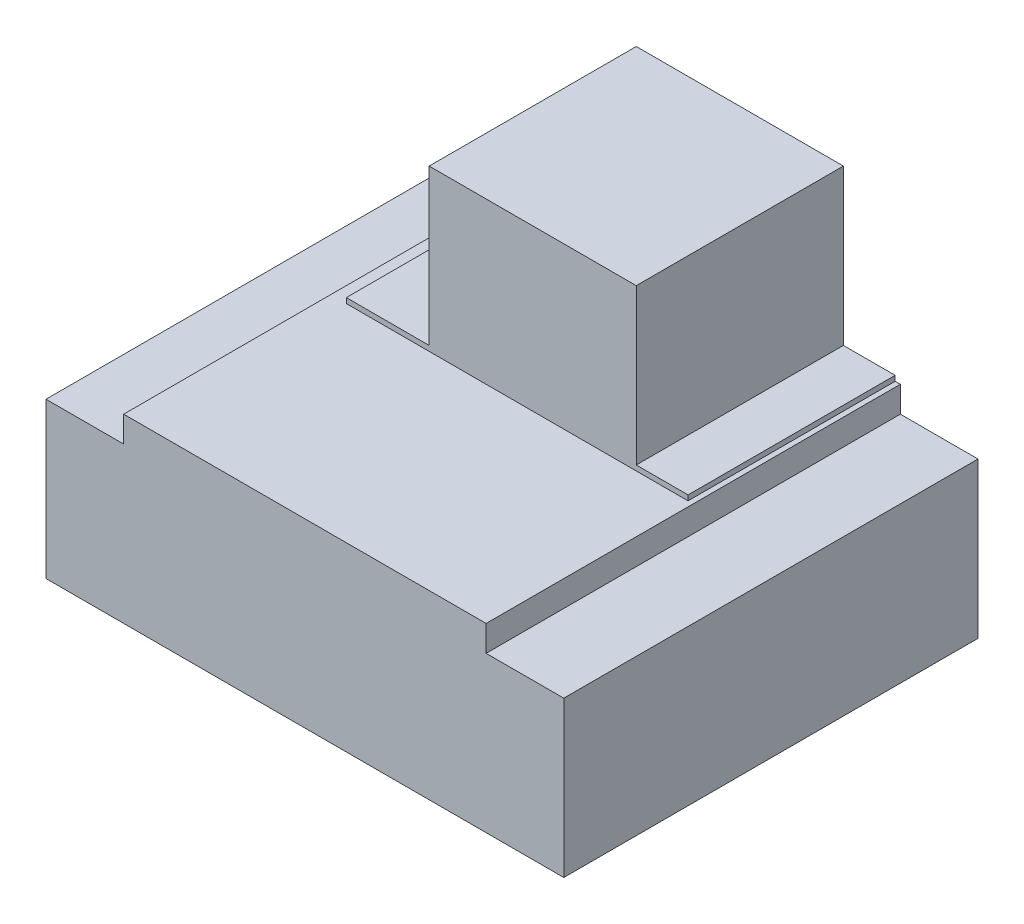
ISO-10303-21;
HEADER;
FILE_DESCRIPTION(('STEP AP214'),'2;1');
FILE_NAME('part.step','',(''),(''),'','','');
FILE_SCHEMA(('AUTOMOTIVE_DESIGN { 1 0 10303 214 1 1 1 1 }'));
ENDSEC;
DATA;
#1=APPLICATION_CONTEXT('core data for automotive mechanical design processes');
#2=APPLICATION_PROTOCOL_DEFINITION('international standard','automotive_design',2000,#1);
#3=PRODUCT_CONTEXT('',#1,'mechanical');
#4=PRODUCT('Part','Part','',(#3));
#5=PRODUCT_RELATED_PRODUCT_CATEGORY('part','',(#4));
#6=PRODUCT_DEFINITION_FORMATION('','',#4);
#7=PRODUCT_DEFINITION_CONTEXT('part definition',#1,'design');
#8=PRODUCT_DEFINITION('design','',#6,#7);
#9=PRODUCT_DEFINITION_SHAPE('','',#8);
#10=(LENGTH_UNIT() NAMED_UNIT(*) SI_UNIT(.MILLI.,.METRE.));
#11=(NAMED_UNIT(*) PLANE_ANGLE_UNIT() SI_UNIT($,.RADIAN.));
#12=(NAMED_UNIT(*) SI_UNIT($,.STERADIAN.) SOLID_ANGLE_UNIT());
#13=UNCERTAINTY_MEASURE_WITH_UNIT(LENGTH_MEASURE(1.E-05),#10,'distance_accuracy_value','');
#14=(GEOMETRIC_REPRESENTATION_CONTEXT(3) GLOBAL_UNCERTAINTY_ASSIGNED_CONTEXT((#13)) GLOBAL_UNIT_ASSIGNED_CONTEXT((#10,
#11,#12)) REPRESENTATION_CONTEXT('',''));
#15=CARTESIAN_POINT('',(0.,0.,0.));
#16=DIRECTION('',(0.,0.,1.));
#17=DIRECTION('',(1.,0.,0.));
#18=AXIS2_PLACEMENT_3D('',#15,#16,#17);
#19=CARTESIAN_POINT('',(0.,35.,0.));
#20=DIRECTION('',(1.,0.,0.));
#21=DIRECTION('',(0.,0.,-1.));
#22=AXIS2_PLACEMENT_3D('',#19,#20,#21);
#23=PLANE('',#22);
#24=DIRECTION('',(0.,0.,1.));
#25=VECTOR('',#24,1.);
#26=CARTESIAN_POINT('',(0.,30.,-80.));
#27=LINE('',#26,#25);
#28=CARTESIAN_POINT('',(0.,30.,-80.));
#29=VERTEX_POINT('',#28);
#30=CARTESIAN_POINT('',(0.,30.,0.));
#31=VERTEX_POINT('',#30);
#32=EDGE_CURVE('E145',#29,#31,#27,.T.);
#33=ORIENTED_EDGE('',*,*,#32,.F.);
#34=DIRECTION('',(0.,-1.,0.));
#35=VECTOR('',#34,1.);
#36=CARTESIAN_POINT('',(0.,35.,-80.));
#37=LINE('',#36,#35);
#38=CARTESIAN_POINT('',(0.,0.,-80.));
#39=VERTEX_POINT('',#38);
#40=EDGE_CURVE('E167',#29,#39,#37,.T.);
#41=ORIENTED_EDGE('',*,*,#40,.T.);
#42=DIRECTION('',(0.,0.,1.));
#43=VECTOR('',#42,1.);
#44=CARTESIAN_POINT('',(0.,0.,0.));
#45=LINE('',#44,#43);
#46=CARTESIAN_POINT('',(0.,0.,0.));
#47=VERTEX_POINT('',#46);
#48=EDGE_CURVE('E166',#39,#47,#45,.T.);
#49=ORIENTED_EDGE('',*,*,#48,.T.);
#50=DIRECTION('',(0.,-1.,0.));
#51=VECTOR('',#50,1.);
#52=CARTESIAN_POINT('',(0.,35.,0.));
#53=LINE('',#52,#51);
#54=EDGE_CURVE('E11',#31,#47,#53,.T.);
#55=ORIENTED_EDGE('',*,*,#54,.F.);
#56=EDGE_LOOP('',(#33,#41,#49,#55));
#57=FACE_BOUND('',#56,.T.);
#58=ADVANCED_FACE('F35',(#57),#23,.F.);
#59=CARTESIAN_POINT('',(0.,36.,0.));
#60=DIRECTION('',(0.,1.,0.));
#61=DIRECTION('',(0.,0.,1.));
#62=AXIS2_PLACEMENT_3D('',#59,#60,#61);
#63=PLANE('',#62);
#64=DIRECTION('',(0.,0.,1.));
#65=VECTOR('',#64,1.);
#66=CARTESIAN_POINT('',(34.,36.,-80.));
#67=LINE('',#66,#65);
#68=CARTESIAN_POINT('',(34.,36.,-80.));
#69=VERTEX_POINT('',#68);
#70=CARTESIAN_POINT('',(34.,36.,-40.));
#71=VERTEX_POINT('',#70);
#72=EDGE_CURVE('E229',#69,#71,#67,.T.);
#73=ORIENTED_EDGE('',*,*,#72,.F.);
#74=DIRECTION('',(-1.,0.,0.));
#75=VECTOR('',#74,1.);
#76=CARTESIAN_POINT('',(18.,36.,-80.));
#77=LINE('',#76,#75);
#78=CARTESIAN_POINT('',(18.,36.,-80.));
#79=VERTEX_POINT('',#78);
#80=EDGE_CURVE('E256',#69,#79,#77,.T.);
#81=ORIENTED_EDGE('',*,*,#80,.T.);
#82=DIRECTION('',(0.,0.,1.));
#83=VECTOR('',#82,1.);
#84=CARTESIAN_POINT('',(18.,36.,-80.));
#85=LINE('',#84,#83);
#86=CARTESIAN_POINT('',(18.,36.,-40.));
#87=VERTEX_POINT('',#86);
#88=EDGE_CURVE('E247',#79,#87,#85,.T.);
#89=ORIENTED_EDGE('',*,*,#88,.T.);
#90=DIRECTION('',(1.,0.,0.));
#91=VECTOR('',#90,1.);
#92=CARTESIAN_POINT('',(18.,36.,-40.));
#93=LINE('',#92,#91);
#94=EDGE_CURVE('E252',#87,#71,#93,.T.);
#95=ORIENTED_EDGE('',*,*,#94,.T.);
#96=EDGE_LOOP('',(#73,#81,#89,#95));
#97=FACE_BOUND('',#96,.T.);
#98=ADVANCED_FACE('F306',(#97),#63,.T.);
#99=CARTESIAN_POINT('',(0.,35.,0.));
#100=DIRECTION('',(0.,-1.,0.));
#101=DIRECTION('',(0.,0.,-1.));
#102=AXIS2_PLACEMENT_3D('',#99,#100,#101);
#103=PLANE('',#102);
#104=DIRECTION('',(-1.,0.,0.));
#105=VECTOR('',#104,1.);
#106=CARTESIAN_POINT('',(0.,35.,-80.));
#107=LINE('',#106,#105);
#108=CARTESIAN_POINT('',(18.,35.,-80.));
#109=VERTEX_POINT('',#108);
#110=CARTESIAN_POINT('',(15.,35.,-80.));
#111=VERTEX_POINT('',#110);
#112=EDGE_CURVE('E274',#109,#111,#107,.T.);
#113=ORIENTED_EDGE('',*,*,#112,.T.);
#114=DIRECTION('',(0.,0.,-1.));
#115=VECTOR('',#114,1.);
#116=CARTESIAN_POINT('',(15.,35.,-80.));
#117=LINE('',#116,#115);
#118=CARTESIAN_POINT('',(15.,35.,0.));
#119=VERTEX_POINT('',#118);
#120=EDGE_CURVE('E155',#119,#111,#117,.T.);
#121=ORIENTED_EDGE('',*,*,#120,.F.);
#122=DIRECTION('',(1.,0.,0.));
#123=VECTOR('',#122,1.);
#124=CARTESIAN_POINT('',(0.,35.,0.));
#125=LINE('',#124,#123);
#126=CARTESIAN_POINT('',(85.,35.,0.));
#127=VERTEX_POINT('',#126);
#128=EDGE_CURVE('E187',#119,#127,#125,.T.);
#129=ORIENTED_EDGE('',*,*,#128,.T.);
#130=DIRECTION('',(0.,0.,1.));
#131=VECTOR('',#130,1.);
#132=CARTESIAN_POINT('',(85.,35.,-80.));
#133=LINE('',#132,#131);
#134=CARTESIAN_POINT('',(85.,35.,-80.));
#135=VERTEX_POINT('',#134);
#136=EDGE_CURVE('E208',#135,#127,#133,.T.);
#137=ORIENTED_EDGE('',*,*,#136,.F.);
#138=CARTESIAN_POINT('',(84.,35.,-80.));
#139=VERTEX_POINT('',#138);
#140=EDGE_CURVE('E180',#135,#139,#107,.T.);
#141=ORIENTED_EDGE('',*,*,#140,.T.);
#142=DIRECTION('',(0.,0.,-1.));
#143=VECTOR('',#142,1.);
#144=CARTESIAN_POINT('',(84.,35.,-80.));
#145=LINE('',#144,#143);
#146=CARTESIAN_POINT('',(84.,35.,-40.));
#147=VERTEX_POINT('',#146);
#148=EDGE_CURVE('E251',#147,#139,#145,.T.);
#149=ORIENTED_EDGE('',*,*,#148,.F.);
#150=DIRECTION('',(1.,0.,0.));
#151=VECTOR('',#150,1.);
#152=CARTESIAN_POINT('',(18.,35.,-40.));
#153=LINE('',#152,#151);
#154=CARTESIAN_POINT('',(18.,35.,-40.));
#155=VERTEX_POINT('',#154);
#156=EDGE_CURVE('E262',#155,#147,#153,.T.);
#157=ORIENTED_EDGE('',*,*,#156,.F.);
#158=DIRECTION('',(0.,0.,1.));
#159=VECTOR('',#158,1.);
#160=CARTESIAN_POINT('',(18.,35.,-80.));
#161=LINE('',#160,#159);
#162=EDGE_CURVE('E246',#109,#155,#161,.T.);
#163=ORIENTED_EDGE('',*,*,#162,.F.);
#164=EDGE_LOOP('',(#113,#121,#129,#137,#141,#149,#157,#163));
#165=FACE_BOUND('',#164,.T.);
#166=ADVANCED_FACE('F280',(#165),#103,.F.);
#167=CARTESIAN_POINT('',(0.,35.,0.));
#168=DIRECTION('',(0.,0.,-1.));
#169=DIRECTION('',(-1.,0.,0.));
#170=AXIS2_PLACEMENT_3D('',#167,#168,#169);
#171=PLANE('',#170);
#172=ORIENTED_EDGE('',*,*,#128,.F.);
#173=DIRECTION('',(0.,1.,0.));
#174=VECTOR('',#173,1.);
#175=CARTESIAN_POINT('',(15.,30.,0.));
#176=LINE('',#175,#174);
#177=CARTESIAN_POINT('',(15.,30.,0.));
#178=VERTEX_POINT('',#177);
#179=EDGE_CURVE('E162',#178,#119,#176,.T.);
#180=ORIENTED_EDGE('',*,*,#179,.F.);
#181=DIRECTION('',(1.,0.,0.));
#182=VECTOR('',#181,1.);
#183=CARTESIAN_POINT('',(0.,30.,0.));
#184=LINE('',#183,#182);
#185=EDGE_CURVE('E148',#31,#178,#184,.T.);
#186=ORIENTED_EDGE('',*,*,#185,.F.);
#187=ORIENTED_EDGE('',*,*,#54,.T.);
#188=DIRECTION('',(1.,0.,0.));
#189=VECTOR('',#188,1.);
#190=CARTESIAN_POINT('',(0.,0.,0.));
#191=LINE('',#190,#189);
#192=CARTESIAN_POINT('',(100.,0.,0.));
#193=VERTEX_POINT('',#192);
#194=EDGE_CURVE('E171',#47,#193,#191,.T.);
#195=ORIENTED_EDGE('',*,*,#194,.T.);
#196=DIRECTION('',(0.,-1.,0.));
#197=VECTOR('',#196,1.);
#198=CARTESIAN_POINT('',(100.,35.,0.));
#199=LINE('',#198,#197);
#200=CARTESIAN_POINT('',(100.,30.,0.));
#201=VERTEX_POINT('',#200);
#202=EDGE_CURVE('E42',#201,#193,#199,.T.);
#203=ORIENTED_EDGE('',*,*,#202,.F.);
#204=DIRECTION('',(1.,0.,0.));
#205=VECTOR('',#204,1.);
#206=CARTESIAN_POINT('',(100.,30.,0.));
#207=LINE('',#206,#205);
#208=CARTESIAN_POINT('',(85.,30.,0.));
#209=VERTEX_POINT('',#208);
#210=EDGE_CURVE('E206',#209,#201,#207,.T.);
#211=ORIENTED_EDGE('',*,*,#210,.F.);
#212=DIRECTION('',(0.,1.,0.));
#213=VECTOR('',#212,1.);
#214=CARTESIAN_POINT('',(85.,30.,0.));
#215=LINE('',#214,#213);
#216=EDGE_CURVE('E214',#209,#127,#215,.T.);
#217=ORIENTED_EDGE('',*,*,#216,.T.);
#218=EDGE_LOOP('',(#172,#180,#186,#187,#195,#203,#211,#217));
#219=FACE_BOUND('',#218,.T.);
#220=ADVANCED_FACE('F159',(#219),#171,.F.);
#221=CARTESIAN_POINT('',(100.,35.,0.));
#222=DIRECTION('',(-1.,0.,0.));
#223=DIRECTION('',(0.,0.,1.));
#224=AXIS2_PLACEMENT_3D('',#221,#222,#223);
#225=PLANE('',#224);
#226=DIRECTION('',(0.,-1.,0.));
#227=VECTOR('',#226,1.);
#228=CARTESIAN_POINT('',(100.,35.,-80.));
#229=LINE('',#228,#227);
#230=CARTESIAN_POINT('',(100.,30.,-80.));
#231=VERTEX_POINT('',#230);
#232=CARTESIAN_POINT('',(100.,0.,-80.));
#233=VERTEX_POINT('',#232);
#234=EDGE_CURVE('E189',#231,#233,#229,.T.);
#235=ORIENTED_EDGE('',*,*,#234,.F.);
#236=DIRECTION('',(0.,0.,-1.));
#237=VECTOR('',#236,1.);
#238=CARTESIAN_POINT('',(100.,30.,-80.));
#239=LINE('',#238,#237);
#240=EDGE_CURVE('E57',#201,#231,#239,.T.);
#241=ORIENTED_EDGE('',*,*,#240,.F.);
#242=ORIENTED_EDGE('',*,*,#202,.T.);
#243=DIRECTION('',(0.,0.,-1.));
#244=VECTOR('',#243,1.);
#245=CARTESIAN_POINT('',(100.,0.,0.));
#246=LINE('',#245,#244);
#247=EDGE_CURVE('E174',#193,#233,#246,.T.);
#248=ORIENTED_EDGE('',*,*,#247,.T.);
#249=EDGE_LOOP('',(#235,#241,#242,#248));
#250=FACE_BOUND('',#249,.T.);
#251=ADVANCED_FACE('F193',(#250),#225,.F.);
#252=CARTESIAN_POINT('',(0.,35.,-80.));
#253=DIRECTION('',(0.,0.,1.));
#254=DIRECTION('',(1.,0.,0.));
#255=AXIS2_PLACEMENT_3D('',#252,#253,#254);
#256=PLANE('',#255);
#257=DIRECTION('',(-1.,0.,0.));
#258=VECTOR('',#257,1.);
#259=CARTESIAN_POINT('',(0.,30.,-80.));
#260=LINE('',#259,#258);
#261=CARTESIAN_POINT('',(15.,30.,-80.));
#262=VERTEX_POINT('',#261);
#263=EDGE_CURVE('E151',#262,#29,#260,.T.);
#264=ORIENTED_EDGE('',*,*,#263,.F.);
#265=DIRECTION('',(0.,1.,0.));
#266=VECTOR('',#265,1.);
#267=CARTESIAN_POINT('',(15.,30.,-80.));
#268=LINE('',#267,#266);
#269=EDGE_CURVE('E232',#262,#111,#268,.T.);
#270=ORIENTED_EDGE('',*,*,#269,.T.);
#271=ORIENTED_EDGE('',*,*,#112,.F.);
#272=DIRECTION('',(0.,-1.,0.));
#273=VECTOR('',#272,1.);
#274=CARTESIAN_POINT('',(18.,36.,-80.));
#275=LINE('',#274,#273);
#276=EDGE_CURVE('E259',#79,#109,#275,.T.);
#277=ORIENTED_EDGE('',*,*,#276,.F.);
#278=ORIENTED_EDGE('',*,*,#80,.F.);
#279=DIRECTION('',(0.,-1.,0.));
#280=VECTOR('',#279,1.);
#281=CARTESIAN_POINT('',(34.,66.,-80.));
#282=LINE('',#281,#280);
#283=CARTESIAN_POINT('',(34.,66.,-80.));
#284=VERTEX_POINT('',#283);
#285=EDGE_CURVE('E228',#284,#69,#282,.T.);
#286=ORIENTED_EDGE('',*,*,#285,.F.);
#287=DIRECTION('',(-1.,0.,0.));
#288=VECTOR('',#287,1.);
#289=CARTESIAN_POINT('',(34.,66.,-80.));
#290=LINE('',#289,#288);
#291=CARTESIAN_POINT('',(74.,66.,-80.));
#292=VERTEX_POINT('',#291);
#293=EDGE_CURVE('E226',#292,#284,#290,.T.);
#294=ORIENTED_EDGE('',*,*,#293,.F.);
#295=DIRECTION('',(0.,-1.,0.));
#296=VECTOR('',#295,1.);
#297=CARTESIAN_POINT('',(74.,66.,-80.));
#298=LINE('',#297,#296);
#299=CARTESIAN_POINT('',(74.,36.,-80.));
#300=VERTEX_POINT('',#299);
#301=EDGE_CURVE('E237',#292,#300,#298,.T.);
#302=ORIENTED_EDGE('',*,*,#301,.T.);
#303=CARTESIAN_POINT('',(84.,36.,-80.));
#304=VERTEX_POINT('',#303);
#305=EDGE_CURVE('E257',#304,#300,#77,.T.);
#306=ORIENTED_EDGE('',*,*,#305,.F.);
#307=DIRECTION('',(0.,-1.,0.));
#308=VECTOR('',#307,1.);
#309=CARTESIAN_POINT('',(84.,36.,-80.));
#310=LINE('',#309,#308);
#311=EDGE_CURVE('E269',#304,#139,#310,.T.);
#312=ORIENTED_EDGE('',*,*,#311,.T.);
#313=ORIENTED_EDGE('',*,*,#140,.F.);
#314=DIRECTION('',(0.,1.,0.));
#315=VECTOR('',#314,1.);
#316=CARTESIAN_POINT('',(85.,30.,-80.));
#317=LINE('',#316,#315);
#318=CARTESIAN_POINT('',(85.,30.,-80.));
#319=VERTEX_POINT('',#318);
#320=EDGE_CURVE('E202',#319,#135,#317,.T.);
#321=ORIENTED_EDGE('',*,*,#320,.F.);
#322=DIRECTION('',(-1.,0.,0.));
#323=VECTOR('',#322,1.);
#324=CARTESIAN_POINT('',(100.,30.,-80.));
#325=LINE('',#324,#323);
#326=EDGE_CURVE('E200',#231,#319,#325,.T.);
#327=ORIENTED_EDGE('',*,*,#326,.F.);
#328=ORIENTED_EDGE('',*,*,#234,.T.);
#329=DIRECTION('',(-1.,0.,0.));
#330=VECTOR('',#329,1.);
#331=CARTESIAN_POINT('',(0.,0.,-80.));
#332=LINE('',#331,#330);
#333=EDGE_CURVE('E185',#233,#39,#332,.T.);
#334=ORIENTED_EDGE('',*,*,#333,.T.);
#335=ORIENTED_EDGE('',*,*,#40,.F.);
#336=EDGE_LOOP('',(#264,#270,#271,#277,#278,#286,#294,#302,#306,#312,#313,#321,#327,#328,#334,#335));
#337=FACE_BOUND('',#336,.T.);
#338=ADVANCED_FACE('F198',(#337),#256,.F.);
#339=CARTESIAN_POINT('',(0.,0.,0.));
#340=DIRECTION('',(0.,-1.,0.));
#341=DIRECTION('',(0.,0.,-1.));
#342=AXIS2_PLACEMENT_3D('',#339,#340,#341);
#343=PLANE('',#342);
#344=ORIENTED_EDGE('',*,*,#48,.F.);
#345=ORIENTED_EDGE('',*,*,#333,.F.);
#346=ORIENTED_EDGE('',*,*,#247,.F.);
#347=ORIENTED_EDGE('',*,*,#194,.F.);
#348=EDGE_LOOP('',(#344,#345,#346,#347));
#349=FACE_BOUND('',#348,.T.);
#350=ADVANCED_FACE('F196',(#349),#343,.T.);
#351=CARTESIAN_POINT('',(18.,36.,-80.));
#352=DIRECTION('',(1.,0.,0.));
#353=DIRECTION('',(0.,0.,-1.));
#354=AXIS2_PLACEMENT_3D('',#351,#352,#353);
#355=PLANE('',#354);
#356=ORIENTED_EDGE('',*,*,#162,.T.);
#357=DIRECTION('',(0.,-1.,0.));
#358=VECTOR('',#357,1.);
#359=CARTESIAN_POINT('',(18.,36.,-40.));
#360=LINE('',#359,#358);
#361=EDGE_CURVE('E172',#87,#155,#360,.T.);
#362=ORIENTED_EDGE('',*,*,#361,.F.);
#363=ORIENTED_EDGE('',*,*,#88,.F.);
#364=ORIENTED_EDGE('',*,*,#276,.T.);
#365=EDGE_LOOP('',(#356,#362,#363,#364));
#366=FACE_BOUND('',#365,.T.);
#367=ADVANCED_FACE('F304',(#366),#355,.F.);
#368=CARTESIAN_POINT('',(18.,36.,-40.));
#369=DIRECTION('',(0.,0.,-1.));
#370=DIRECTION('',(-1.,0.,0.));
#371=AXIS2_PLACEMENT_3D('',#368,#369,#370);
#372=PLANE('',#371);
#373=ORIENTED_EDGE('',*,*,#156,.T.);
#374=DIRECTION('',(0.,-1.,0.));
#375=VECTOR('',#374,1.);
#376=CARTESIAN_POINT('',(84.,36.,-40.));
#377=LINE('',#376,#375);
#378=CARTESIAN_POINT('',(84.,36.,-40.));
#379=VERTEX_POINT('',#378);
#380=EDGE_CURVE('E177',#379,#147,#377,.T.);
#381=ORIENTED_EDGE('',*,*,#380,.F.);
#382=CARTESIAN_POINT('',(74.,36.,-40.));
#383=VERTEX_POINT('',#382);
#384=EDGE_CURVE('E250',#383,#379,#93,.T.);
#385=ORIENTED_EDGE('',*,*,#384,.F.);
#386=DIRECTION('',(0.,-1.,0.));
#387=VECTOR('',#386,1.);
#388=CARTESIAN_POINT('',(74.,66.,-40.));
#389=LINE('',#388,#387);
#390=CARTESIAN_POINT('',(74.,66.,-40.));
#391=VERTEX_POINT('',#390);
#392=EDGE_CURVE('E240',#391,#383,#389,.T.);
#393=ORIENTED_EDGE('',*,*,#392,.F.);
#394=DIRECTION('',(1.,0.,0.));
#395=VECTOR('',#394,1.);
#396=CARTESIAN_POINT('',(34.,66.,-40.));
#397=LINE('',#396,#395);
#398=CARTESIAN_POINT('',(34.,66.,-40.));
#399=VERTEX_POINT('',#398);
#400=EDGE_CURVE('E221',#399,#391,#397,.T.);
#401=ORIENTED_EDGE('',*,*,#400,.F.);
#402=DIRECTION('',(0.,-1.,0.));
#403=VECTOR('',#402,1.);
#404=CARTESIAN_POINT('',(34.,66.,-40.));
#405=LINE('',#404,#403);
#406=EDGE_CURVE('E243',#399,#71,#405,.T.);
#407=ORIENTED_EDGE('',*,*,#406,.T.);
#408=ORIENTED_EDGE('',*,*,#94,.F.);
#409=ORIENTED_EDGE('',*,*,#361,.T.);
#410=EDGE_LOOP('',(#373,#381,#385,#393,#401,#407,#408,#409));
#411=FACE_BOUND('',#410,.T.);
#412=ADVANCED_FACE('F297',(#411),#372,.F.);
#413=CARTESIAN_POINT('',(84.,36.,-80.));
#414=DIRECTION('',(-1.,0.,0.));
#415=DIRECTION('',(0.,0.,1.));
#416=AXIS2_PLACEMENT_3D('',#413,#414,#415);
#417=PLANE('',#416);
#418=ORIENTED_EDGE('',*,*,#148,.T.);
#419=ORIENTED_EDGE('',*,*,#311,.F.);
#420=DIRECTION('',(0.,0.,-1.));
#421=VECTOR('',#420,1.);
#422=CARTESIAN_POINT('',(84.,36.,-80.));
#423=LINE('',#422,#421);
#424=EDGE_CURVE('E254',#379,#304,#423,.T.);
#425=ORIENTED_EDGE('',*,*,#424,.F.);
#426=ORIENTED_EDGE('',*,*,#380,.T.);
#427=EDGE_LOOP('',(#418,#419,#425,#426));
#428=FACE_BOUND('',#427,.T.);
#429=ADVANCED_FACE('F283',(#428),#417,.F.);
#430=DIRECTION('',(0.,0.,-1.));
#431=VECTOR('',#430,1.);
#432=CARTESIAN_POINT('',(74.,36.,-80.));
#433=LINE('',#432,#431);
#434=EDGE_CURVE('E222',#383,#300,#433,.T.);
#435=ORIENTED_EDGE('',*,*,#434,.F.);
#436=ORIENTED_EDGE('',*,*,#384,.T.);
#437=ORIENTED_EDGE('',*,*,#424,.T.);
#438=ORIENTED_EDGE('',*,*,#305,.T.);
#439=EDGE_LOOP('',(#435,#436,#437,#438));
#440=FACE_BOUND('',#439,.T.);
#441=ADVANCED_FACE('F290',(#440),#63,.T.);
#442=CARTESIAN_POINT('',(34.,66.,-80.));
#443=DIRECTION('',(1.,0.,0.));
#444=DIRECTION('',(0.,0.,-1.));
#445=AXIS2_PLACEMENT_3D('',#442,#443,#444);
#446=PLANE('',#445);
#447=ORIENTED_EDGE('',*,*,#72,.T.);
#448=ORIENTED_EDGE('',*,*,#406,.F.);
#449=DIRECTION('',(0.,0.,1.));
#450=VECTOR('',#449,1.);
#451=CARTESIAN_POINT('',(34.,66.,-80.));
#452=LINE('',#451,#450);
#453=EDGE_CURVE('E218',#284,#399,#452,.T.);
#454=ORIENTED_EDGE('',*,*,#453,.F.);
#455=ORIENTED_EDGE('',*,*,#285,.T.);
#456=EDGE_LOOP('',(#447,#448,#454,#455));
#457=FACE_BOUND('',#456,.T.);
#458=ADVANCED_FACE('F310',(#457),#446,.F.);
#459=CARTESIAN_POINT('',(74.,66.,-80.));
#460=DIRECTION('',(-1.,0.,0.));
#461=DIRECTION('',(0.,0.,1.));
#462=AXIS2_PLACEMENT_3D('',#459,#460,#461);
#463=PLANE('',#462);
#464=ORIENTED_EDGE('',*,*,#434,.T.);
#465=ORIENTED_EDGE('',*,*,#301,.F.);
#466=DIRECTION('',(0.,0.,-1.));
#467=VECTOR('',#466,1.);
#468=CARTESIAN_POINT('',(74.,66.,-80.));
#469=LINE('',#468,#467);
#470=EDGE_CURVE('E224',#391,#292,#469,.T.);
#471=ORIENTED_EDGE('',*,*,#470,.F.);
#472=ORIENTED_EDGE('',*,*,#392,.T.);
#473=EDGE_LOOP('',(#464,#465,#471,#472));
#474=FACE_BOUND('',#473,.T.);
#475=ADVANCED_FACE('F293',(#474),#463,.F.);
#476=CARTESIAN_POINT('',(0.,66.,0.));
#477=DIRECTION('',(0.,1.,0.));
#478=DIRECTION('',(0.,0.,1.));
#479=AXIS2_PLACEMENT_3D('',#476,#477,#478);
#480=PLANE('',#479);
#481=ORIENTED_EDGE('',*,*,#453,.T.);
#482=ORIENTED_EDGE('',*,*,#400,.T.);
#483=ORIENTED_EDGE('',*,*,#470,.T.);
#484=ORIENTED_EDGE('',*,*,#293,.T.);
#485=EDGE_LOOP('',(#481,#482,#483,#484));
#486=FACE_BOUND('',#485,.T.);
#487=ADVANCED_FACE('F313',(#486),#480,.T.);
#488=CARTESIAN_POINT('',(85.,30.,-80.));
#489=DIRECTION('',(-1.,0.,0.));
#490=DIRECTION('',(0.,0.,1.));
#491=AXIS2_PLACEMENT_3D('',#488,#489,#490);
#492=PLANE('',#491);
#493=ORIENTED_EDGE('',*,*,#136,.T.);
#494=ORIENTED_EDGE('',*,*,#216,.F.);
#495=DIRECTION('',(0.,0.,1.));
#496=VECTOR('',#495,1.);
#497=CARTESIAN_POINT('',(85.,30.,-80.));
#498=LINE('',#497,#496);
#499=EDGE_CURVE('E204',#319,#209,#498,.T.);
#500=ORIENTED_EDGE('',*,*,#499,.F.);
#501=ORIENTED_EDGE('',*,*,#320,.T.);
#502=EDGE_LOOP('',(#493,#494,#500,#501));
#503=FACE_BOUND('',#502,.T.);
#504=ADVANCED_FACE('F315',(#503),#492,.F.);
#505=CARTESIAN_POINT('',(0.,30.,0.));
#506=DIRECTION('',(0.,-1.,0.));
#507=DIRECTION('',(0.,0.,-1.));
#508=AXIS2_PLACEMENT_3D('',#505,#506,#507);
#509=PLANE('',#508);
#510=ORIENTED_EDGE('',*,*,#240,.T.);
#511=ORIENTED_EDGE('',*,*,#326,.T.);
#512=ORIENTED_EDGE('',*,*,#499,.T.);
#513=ORIENTED_EDGE('',*,*,#210,.T.);
#514=EDGE_LOOP('',(#510,#511,#512,#513));
#515=FACE_BOUND('',#514,.T.);
#516=ADVANCED_FACE('F322',(#515),#509,.F.);
#517=CARTESIAN_POINT('',(15.,30.,-80.));
#518=DIRECTION('',(1.,0.,0.));
#519=DIRECTION('',(0.,0.,-1.));
#520=AXIS2_PLACEMENT_3D('',#517,#518,#519);
#521=PLANE('',#520);
#522=ORIENTED_EDGE('',*,*,#120,.T.);
#523=ORIENTED_EDGE('',*,*,#269,.F.);
#524=DIRECTION('',(0.,0.,-1.));
#525=VECTOR('',#524,1.);
#526=CARTESIAN_POINT('',(15.,30.,-80.));
#527=LINE('',#526,#525);
#528=EDGE_CURVE('E49',#178,#262,#527,.T.);
#529=ORIENTED_EDGE('',*,*,#528,.F.);
#530=ORIENTED_EDGE('',*,*,#179,.T.);
#531=EDGE_LOOP('',(#522,#523,#529,#530));
#532=FACE_BOUND('',#531,.T.);
#533=ADVANCED_FACE('F380',(#532),#521,.F.);
#534=CARTESIAN_POINT('',(0.,30.,0.));
#535=DIRECTION('',(0.,1.,0.));
#536=DIRECTION('',(0.,0.,1.));
#537=AXIS2_PLACEMENT_3D('',#534,#535,#536);
#538=PLANE('',#537);
#539=ORIENTED_EDGE('',*,*,#32,.T.);
#540=ORIENTED_EDGE('',*,*,#185,.T.);
#541=ORIENTED_EDGE('',*,*,#528,.T.);
#542=ORIENTED_EDGE('',*,*,#263,.T.);
#543=EDGE_LOOP('',(#539,#540,#541,#542));
#544=FACE_BOUND('',#543,.T.);
#545=ADVANCED_FACE('F147',(#544),#538,.T.);
#546=CLOSED_SHELL('',(#58,#98,#166,#220,#251,#338,#350,#367,#412,#429,#441,#458,#475,#487,#504,
#516,#533,#545));
#547=MANIFOLD_SOLID_BREP('B2',#546);
#548=ADVANCED_BREP_SHAPE_REPRESENTATION('',(#18,#547),#14);
#549=SHAPE_DEFINITION_REPRESENTATION(#9,#548);
ENDSEC;
END-ISO-10303-21;
